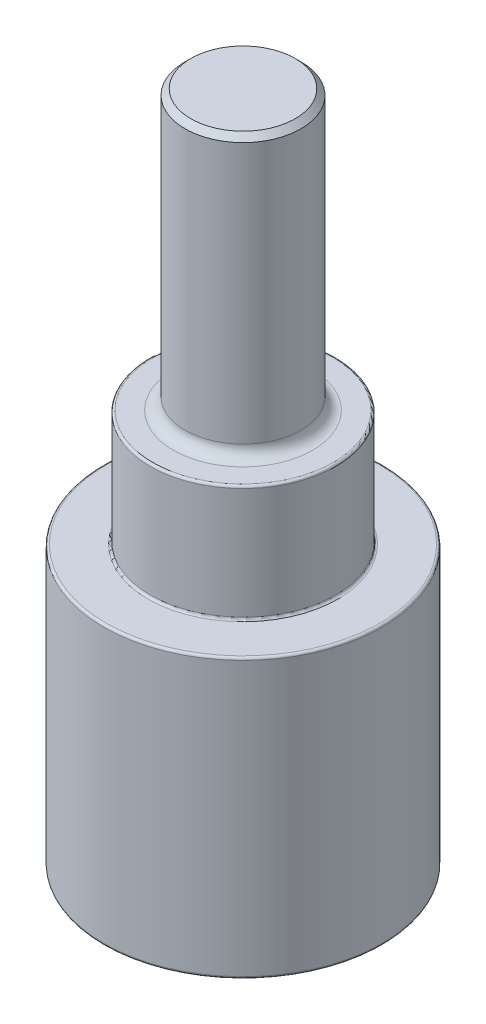
ISO-10303-21;
HEADER;
FILE_DESCRIPTION(('STEP AP214'),'2;1');
FILE_NAME('part.step','',(''),(''),'','','');
FILE_SCHEMA(('AUTOMOTIVE_DESIGN { 1 0 10303 214 1 1 1 1 }'));
ENDSEC;
DATA;
#1=APPLICATION_CONTEXT('core data for automotive mechanical design processes');
#2=APPLICATION_PROTOCOL_DEFINITION('international standard','automotive_design',2000,#1);
#3=PRODUCT_CONTEXT('',#1,'mechanical');
#4=PRODUCT('Part','Part','',(#3));
#5=PRODUCT_RELATED_PRODUCT_CATEGORY('part','',(#4));
#6=PRODUCT_DEFINITION_FORMATION('','',#4);
#7=PRODUCT_DEFINITION_CONTEXT('part definition',#1,'design');
#8=PRODUCT_DEFINITION('design','',#6,#7);
#9=PRODUCT_DEFINITION_SHAPE('','',#8);
#10=(LENGTH_UNIT() NAMED_UNIT(*) SI_UNIT(.MILLI.,.METRE.));
#11=(NAMED_UNIT(*) PLANE_ANGLE_UNIT() SI_UNIT($,.RADIAN.));
#12=(NAMED_UNIT(*) SI_UNIT($,.STERADIAN.) SOLID_ANGLE_UNIT());
#13=UNCERTAINTY_MEASURE_WITH_UNIT(LENGTH_MEASURE(1.E-05),#10,'distance_accuracy_value','');
#14=(GEOMETRIC_REPRESENTATION_CONTEXT(3) GLOBAL_UNCERTAINTY_ASSIGNED_CONTEXT((#13)) GLOBAL_UNIT_ASSIGNED_CONTEXT((#10,
#11,#12)) REPRESENTATION_CONTEXT('',''));
#15=CARTESIAN_POINT('',(0.,0.,0.));
#16=DIRECTION('',(0.,0.,1.));
#17=DIRECTION('',(1.,0.,0.));
#18=AXIS2_PLACEMENT_3D('',#15,#16,#17);
#19=CARTESIAN_POINT('',(0.,17.,0.));
#20=DIRECTION('',(0.,-1.,0.));
#21=DIRECTION('',(0.,0.,-1.));
#22=AXIS2_PLACEMENT_3D('',#19,#20,#21);
#23=PLANE('',#22);
#24=CARTESIAN_POINT('',(0.,16.9999999999959,0.));
#25=DIRECTION('',(0.,-1.,0.));
#26=DIRECTION('',(0.,0.,-1.));
#27=AXIS2_PLACEMENT_3D('',#24,#25,#26);
#28=CIRCLE('',#27,2.24999999994679);
#29=CARTESIAN_POINT('',(0.,16.9999999999959,-2.24999999994679));
#30=VERTEX_POINT('',#29);
#31=EDGE_CURVE('E20',#30,#30,#28,.T.);
#32=ORIENTED_EDGE('',*,*,#31,.F.);
#33=EDGE_LOOP('',(#32));
#34=FACE_BOUND('',#33,.T.);
#35=ADVANCED_FACE('F17',(#34),#23,.F.);
#36=CARTESIAN_POINT('',(0.,16.7500000000587,0.));
#37=DIRECTION('',(0.,-1.,0.));
#38=DIRECTION('',(0.,0.,-1.));
#39=AXIS2_PLACEMENT_3D('',#36,#37,#38);
#40=CONICAL_SURFACE('',#39,2.49999999988404,0.785398163397448);
#41=CARTESIAN_POINT('',(0.,16.75,0.));
#42=DIRECTION('',(0.,-1.,0.));
#43=DIRECTION('',(0.,0.,-1.));
#44=AXIS2_PLACEMENT_3D('',#41,#42,#43);
#45=CIRCLE('',#44,2.5);
#46=CARTESIAN_POINT('',(0.,16.75,-2.5));
#47=VERTEX_POINT('',#46);
#48=EDGE_CURVE('E168',#47,#47,#45,.T.);
#49=ORIENTED_EDGE('',*,*,#48,.F.);
#50=EDGE_LOOP('',(#49));
#51=FACE_BOUND('',#50,.T.);
#52=ORIENTED_EDGE('',*,*,#31,.T.);
#53=EDGE_LOOP('',(#52));
#54=FACE_BOUND('',#53,.T.);
#55=ADVANCED_FACE('F183',(#51,#54),#40,.T.);
#56=CARTESIAN_POINT('',(0.,17.,0.));
#57=DIRECTION('',(0.,-1.,0.));
#58=DIRECTION('',(0.,0.,-1.));
#59=AXIS2_PLACEMENT_3D('',#56,#57,#58);
#60=CYLINDRICAL_SURFACE('',#59,2.5);
#61=CARTESIAN_POINT('',(0.,5.5,0.));
#62=DIRECTION('',(0.,-1.,0.));
#63=DIRECTION('',(0.,0.,-1.));
#64=AXIS2_PLACEMENT_3D('',#61,#62,#63);
#65=CIRCLE('',#64,2.5);
#66=CARTESIAN_POINT('',(0.,5.5,-2.5));
#67=VERTEX_POINT('',#66);
#68=EDGE_CURVE('E154',#67,#67,#65,.F.);
#69=ORIENTED_EDGE('',*,*,#68,.T.);
#70=EDGE_LOOP('',(#69));
#71=FACE_BOUND('',#70,.T.);
#72=ORIENTED_EDGE('',*,*,#48,.T.);
#73=EDGE_LOOP('',(#72));
#74=FACE_BOUND('',#73,.T.);
#75=ADVANCED_FACE('F160',(#71,#74),#60,.T.);
#76=CARTESIAN_POINT('',(0.,5.5,0.));
#77=DIRECTION('',(0.,-1.,0.));
#78=DIRECTION('',(0.,0.,-1.));
#79=AXIS2_PLACEMENT_3D('',#76,#77,#78);
#80=TOROIDAL_SURFACE('',#79,3.,0.5);
#81=CARTESIAN_POINT('',(0.,5.,0.));
#82=DIRECTION('',(0.,1.,0.));
#83=DIRECTION('',(0.,0.,-1.));
#84=AXIS2_PLACEMENT_3D('',#81,#82,#83);
#85=CIRCLE('',#84,3.);
#86=CARTESIAN_POINT('',(0.,5.,-3.));
#87=VERTEX_POINT('',#86);
#88=EDGE_CURVE('E179',#87,#87,#85,.T.);
#89=ORIENTED_EDGE('',*,*,#88,.T.);
#90=EDGE_LOOP('',(#89));
#91=FACE_BOUND('',#90,.T.);
#92=ORIENTED_EDGE('',*,*,#68,.F.);
#93=EDGE_LOOP('',(#92));
#94=FACE_BOUND('',#93,.T.);
#95=ADVANCED_FACE('F156',(#91,#94),#80,.F.);
#96=CARTESIAN_POINT('',(0.,5.,0.));
#97=DIRECTION('',(0.,-1.,0.));
#98=DIRECTION('',(0.,0.,-1.));
#99=AXIS2_PLACEMENT_3D('',#96,#97,#98);
#100=PLANE('',#99);
#101=ORIENTED_EDGE('',*,*,#88,.F.);
#102=EDGE_LOOP('',(#101));
#103=FACE_BOUND('',#102,.T.);
#104=CARTESIAN_POINT('',(0.,5.,0.));
#105=DIRECTION('',(0.,-1.,0.));
#106=DIRECTION('',(0.,0.,-1.));
#107=AXIS2_PLACEMENT_3D('',#104,#105,#106);
#108=CIRCLE('',#107,3.9);
#109=CARTESIAN_POINT('',(0.,5.,-3.9));
#110=VERTEX_POINT('',#109);
#111=EDGE_CURVE('E123',#110,#110,#108,.T.);
#112=ORIENTED_EDGE('',*,*,#111,.F.);
#113=EDGE_LOOP('',(#112));
#114=FACE_BOUND('',#113,.T.);
#115=ADVANCED_FACE('F136',(#103,#114),#100,.F.);
#116=CARTESIAN_POINT('',(0.,4.9,0.));
#117=DIRECTION('',(0.,-1.,0.));
#118=DIRECTION('',(0.,0.,-1.));
#119=AXIS2_PLACEMENT_3D('',#116,#117,#118);
#120=TOROIDAL_SURFACE('',#119,3.9,0.1);
#121=CARTESIAN_POINT('',(0.,4.9,0.));
#122=DIRECTION('',(0.,-1.,0.));
#123=DIRECTION('',(0.,0.,-1.));
#124=AXIS2_PLACEMENT_3D('',#121,#122,#123);
#125=CIRCLE('',#124,4.);
#126=CARTESIAN_POINT('',(0.,4.9,-4.));
#127=VERTEX_POINT('',#126);
#128=EDGE_CURVE('E115',#127,#127,#125,.T.);
#129=ORIENTED_EDGE('',*,*,#128,.F.);
#130=EDGE_LOOP('',(#129));
#131=FACE_BOUND('',#130,.T.);
#132=ORIENTED_EDGE('',*,*,#111,.T.);
#133=EDGE_LOOP('',(#132));
#134=FACE_BOUND('',#133,.T.);
#135=ADVANCED_FACE('F131',(#131,#134),#120,.T.);
#136=CARTESIAN_POINT('',(0.,5.,0.));
#137=DIRECTION('',(0.,-1.,0.));
#138=DIRECTION('',(0.,0.,-1.));
#139=AXIS2_PLACEMENT_3D('',#136,#137,#138);
#140=CYLINDRICAL_SURFACE('',#139,4.);
#141=CARTESIAN_POINT('',(0.,0.1,0.));
#142=DIRECTION('',(0.,1.,0.));
#143=DIRECTION('',(0.,0.,1.));
#144=AXIS2_PLACEMENT_3D('',#141,#142,#143);
#145=CIRCLE('',#144,4.);
#146=CARTESIAN_POINT('',(0.,0.1,4.));
#147=VERTEX_POINT('',#146);
#148=EDGE_CURVE('E79',#147,#147,#145,.T.);
#149=ORIENTED_EDGE('',*,*,#148,.T.);
#150=EDGE_LOOP('',(#149));
#151=FACE_BOUND('',#150,.T.);
#152=ORIENTED_EDGE('',*,*,#128,.T.);
#153=EDGE_LOOP('',(#152));
#154=FACE_BOUND('',#153,.T.);
#155=ADVANCED_FACE('F135',(#151,#154),#140,.T.);
#156=CARTESIAN_POINT('',(0.,-2.,0.));
#157=DIRECTION('',(0.,-1.,0.));
#158=DIRECTION('',(0.,0.,-1.));
#159=AXIS2_PLACEMENT_3D('',#156,#157,#158);
#160=PLANE('',#159);
#161=DIRECTION('',(-0.86602540378444,0.,0.499999999999998));
#162=VECTOR('',#161,1.);
#163=CARTESIAN_POINT('',(-3.04999999999999,-2.,-1.76091832102837));
#164=LINE('',#163,#162);
#165=CARTESIAN_POINT('',(-3.04999999999999,-2.,-1.76091832102837));
#166=VERTEX_POINT('',#165);
#167=CARTESIAN_POINT('',(0.,-2.,-3.52183664205672));
#168=VERTEX_POINT('',#167);
#169=EDGE_CURVE('E93',#166,#168,#164,.F.);
#170=ORIENTED_EDGE('',*,*,#169,.T.);
#171=DIRECTION('',(-0.866025403784437,0.,-0.500000000000003));
#172=VECTOR('',#171,1.);
#173=CARTESIAN_POINT('',(0.,-2.,-3.52183664205672));
#174=LINE('',#173,#172);
#175=CARTESIAN_POINT('',(3.05,-2.,-1.76091832102835));
#176=VERTEX_POINT('',#175);
#177=EDGE_CURVE('E282',#168,#176,#174,.F.);
#178=ORIENTED_EDGE('',*,*,#177,.T.);
#179=DIRECTION('',(0.,0.,-1.));
#180=VECTOR('',#179,1.);
#181=CARTESIAN_POINT('',(3.05,-2.,-1.76091832102835));
#182=LINE('',#181,#180);
#183=CARTESIAN_POINT('',(3.04999999999999,-2.,1.76091832102836));
#184=VERTEX_POINT('',#183);
#185=EDGE_CURVE('E277',#176,#184,#182,.F.);
#186=ORIENTED_EDGE('',*,*,#185,.T.);
#187=DIRECTION('',(0.86602540378444,0.,-0.499999999999998));
#188=VECTOR('',#187,1.);
#189=CARTESIAN_POINT('',(3.04999999999999,-2.,1.76091832102836));
#190=LINE('',#189,#188);
#191=CARTESIAN_POINT('',(0.,-2.,3.5218366420567));
#192=VERTEX_POINT('',#191);
#193=EDGE_CURVE('E75',#184,#192,#190,.F.);
#194=ORIENTED_EDGE('',*,*,#193,.T.);
#195=DIRECTION('',(0.866025403784438,0.,0.5));
#196=VECTOR('',#195,1.);
#197=CARTESIAN_POINT('',(0.,-2.,3.5218366420567));
#198=LINE('',#197,#196);
#199=CARTESIAN_POINT('',(-3.04999999999999,-2.,1.76091832102834));
#200=VERTEX_POINT('',#199);
#201=EDGE_CURVE('E71',#192,#200,#198,.F.);
#202=ORIENTED_EDGE('',*,*,#201,.T.);
#203=DIRECTION('',(0.,0.,1.));
#204=VECTOR('',#203,1.);
#205=CARTESIAN_POINT('',(-3.04999999999999,-2.,1.76091832102834));
#206=LINE('',#205,#204);
#207=EDGE_CURVE('E68',#200,#166,#206,.F.);
#208=ORIENTED_EDGE('',*,*,#207,.T.);
#209=EDGE_LOOP('',(#170,#178,#186,#194,#202,#208));
#210=FACE_BOUND('',#209,.T.);
#211=ADVANCED_FACE('F73',(#210),#160,.T.);
#212=CARTESIAN_POINT('',(0.,0.1,0.));
#213=DIRECTION('',(0.,1.,0.));
#214=DIRECTION('',(0.,0.,1.));
#215=AXIS2_PLACEMENT_3D('',#212,#213,#214);
#216=TOROIDAL_SURFACE('',#215,4.1,0.1);
#217=CARTESIAN_POINT('',(0.,0.,0.));
#218=DIRECTION('',(0.,1.,0.));
#219=DIRECTION('',(0.,0.,1.));
#220=AXIS2_PLACEMENT_3D('',#217,#218,#219);
#221=CIRCLE('',#220,4.1);
#222=CARTESIAN_POINT('',(0.,0.,4.1));
#223=VERTEX_POINT('',#222);
#224=EDGE_CURVE('E273',#223,#223,#221,.F.);
#225=ORIENTED_EDGE('',*,*,#224,.F.);
#226=EDGE_LOOP('',(#225));
#227=FACE_BOUND('',#226,.T.);
#228=ORIENTED_EDGE('',*,*,#148,.F.);
#229=EDGE_LOOP('',(#228));
#230=FACE_BOUND('',#229,.T.);
#231=ADVANCED_FACE('F101',(#227,#230),#216,.F.);
#232=CARTESIAN_POINT('',(0.,-2.,3.5218366420567));
#233=DIRECTION('',(-0.5,0.,0.866025403784438));
#234=DIRECTION('',(0.866025403784438,0.,0.5));
#235=AXIS2_PLACEMENT_3D('',#232,#233,#234);
#236=PLANE('',#235);
#237=DIRECTION('',(0.,1.,0.));
#238=VECTOR('',#237,1.);
#239=CARTESIAN_POINT('',(-3.04999999999999,-2.,1.76091832102834));
#240=LINE('',#239,#238);
#241=CARTESIAN_POINT('',(-3.04999999999999,-12.,1.76091832102834));
#242=VERTEX_POINT('',#241);
#243=EDGE_CURVE('E78',#242,#200,#240,.T.);
#244=ORIENTED_EDGE('',*,*,#243,.T.);
#245=ORIENTED_EDGE('',*,*,#201,.F.);
#246=DIRECTION('',(0.,1.,0.));
#247=VECTOR('',#246,1.);
#248=CARTESIAN_POINT('',(0.,-2.,3.5218366420567));
#249=LINE('',#248,#247);
#250=CARTESIAN_POINT('',(0.,-12.,3.5218366420567));
#251=VERTEX_POINT('',#250);
#252=EDGE_CURVE('E266',#192,#251,#249,.F.);
#253=ORIENTED_EDGE('',*,*,#252,.T.);
#254=DIRECTION('',(-0.866025403784438,0.,-0.500000000000002));
#255=VECTOR('',#254,1.);
#256=CARTESIAN_POINT('',(0.,-12.,3.5218366420567));
#257=LINE('',#256,#255);
#258=EDGE_CURVE('E84',#251,#242,#257,.T.);
#259=ORIENTED_EDGE('',*,*,#258,.T.);
#260=EDGE_LOOP('',(#244,#245,#253,#259));
#261=FACE_BOUND('',#260,.T.);
#262=ADVANCED_FACE('F82',(#261),#236,.F.);
#263=CARTESIAN_POINT('',(-3.04999999999999,-2.,1.76091832102834));
#264=DIRECTION('',(-1.,0.,0.));
#265=DIRECTION('',(0.,0.,1.));
#266=AXIS2_PLACEMENT_3D('',#263,#264,#265);
#267=PLANE('',#266);
#268=DIRECTION('',(0.,1.,0.));
#269=VECTOR('',#268,1.);
#270=CARTESIAN_POINT('',(-3.04999999999999,-2.,-1.76091832102837));
#271=LINE('',#270,#269);
#272=CARTESIAN_POINT('',(-3.04999999999999,-12.,-1.76091832102837));
#273=VERTEX_POINT('',#272);
#274=EDGE_CURVE('E90',#273,#166,#271,.T.);
#275=ORIENTED_EDGE('',*,*,#274,.T.);
#276=ORIENTED_EDGE('',*,*,#207,.F.);
#277=ORIENTED_EDGE('',*,*,#243,.F.);
#278=DIRECTION('',(0.,0.,1.));
#279=VECTOR('',#278,1.);
#280=CARTESIAN_POINT('',(-3.04999999999999,-12.,0.));
#281=LINE('',#280,#279);
#282=EDGE_CURVE('E302',#242,#273,#281,.F.);
#283=ORIENTED_EDGE('',*,*,#282,.T.);
#284=EDGE_LOOP('',(#275,#276,#277,#283));
#285=FACE_BOUND('',#284,.T.);
#286=ADVANCED_FACE('F88',(#285),#267,.F.);
#287=CARTESIAN_POINT('',(-3.04999999999999,-2.,-1.76091832102837));
#288=DIRECTION('',(-0.499999999999998,0.,-0.86602540378444));
#289=DIRECTION('',(-0.86602540378444,0.,0.499999999999998));
#290=AXIS2_PLACEMENT_3D('',#287,#288,#289);
#291=PLANE('',#290);
#292=DIRECTION('',(0.,1.,0.));
#293=VECTOR('',#292,1.);
#294=CARTESIAN_POINT('',(0.,-2.,-3.52183664205672));
#295=LINE('',#294,#293);
#296=CARTESIAN_POINT('',(0.,-12.,-3.52183664205672));
#297=VERTEX_POINT('',#296);
#298=EDGE_CURVE('E284',#297,#168,#295,.T.);
#299=ORIENTED_EDGE('',*,*,#298,.T.);
#300=ORIENTED_EDGE('',*,*,#169,.F.);
#301=ORIENTED_EDGE('',*,*,#274,.F.);
#302=DIRECTION('',(0.866025403784441,0.,-0.499999999999996));
#303=VECTOR('',#302,1.);
#304=CARTESIAN_POINT('',(-3.04999999999999,-12.,-1.76091832102837));
#305=LINE('',#304,#303);
#306=EDGE_CURVE('E291',#273,#297,#305,.T.);
#307=ORIENTED_EDGE('',*,*,#306,.T.);
#308=EDGE_LOOP('',(#299,#300,#301,#307));
#309=FACE_BOUND('',#308,.T.);
#310=ADVANCED_FACE('F289',(#309),#291,.F.);
#311=CARTESIAN_POINT('',(0.,-2.,-3.52183664205672));
#312=DIRECTION('',(0.500000000000003,0.,-0.866025403784437));
#313=DIRECTION('',(-0.866025403784437,0.,-0.500000000000003));
#314=AXIS2_PLACEMENT_3D('',#311,#312,#313);
#315=PLANE('',#314);
#316=DIRECTION('',(0.,1.,0.));
#317=VECTOR('',#316,1.);
#318=CARTESIAN_POINT('',(3.05,-2.,-1.76091832102835));
#319=LINE('',#318,#317);
#320=CARTESIAN_POINT('',(3.05,-12.,-1.76091832102835));
#321=VERTEX_POINT('',#320);
#322=EDGE_CURVE('E279',#321,#176,#319,.T.);
#323=ORIENTED_EDGE('',*,*,#322,.T.);
#324=ORIENTED_EDGE('',*,*,#177,.F.);
#325=ORIENTED_EDGE('',*,*,#298,.F.);
#326=DIRECTION('',(0.866025403784438,0.,0.500000000000002));
#327=VECTOR('',#326,1.);
#328=CARTESIAN_POINT('',(0.,-12.,-3.52183664205671));
#329=LINE('',#328,#327);
#330=EDGE_CURVE('E296',#297,#321,#329,.T.);
#331=ORIENTED_EDGE('',*,*,#330,.T.);
#332=EDGE_LOOP('',(#323,#324,#325,#331));
#333=FACE_BOUND('',#332,.T.);
#334=ADVANCED_FACE('F294',(#333),#315,.F.);
#335=CARTESIAN_POINT('',(3.05,-2.,-1.76091832102835));
#336=DIRECTION('',(1.,0.,0.));
#337=DIRECTION('',(0.,0.,-1.));
#338=AXIS2_PLACEMENT_3D('',#335,#336,#337);
#339=PLANE('',#338);
#340=DIRECTION('',(0.,1.,0.));
#341=VECTOR('',#340,1.);
#342=CARTESIAN_POINT('',(3.04999999999999,-2.,1.76091832102836));
#343=LINE('',#342,#341);
#344=CARTESIAN_POINT('',(3.04999999999999,-12.,1.76091832102836));
#345=VERTEX_POINT('',#344);
#346=EDGE_CURVE('E275',#345,#184,#343,.T.);
#347=ORIENTED_EDGE('',*,*,#346,.T.);
#348=ORIENTED_EDGE('',*,*,#185,.F.);
#349=ORIENTED_EDGE('',*,*,#322,.F.);
#350=DIRECTION('',(0.,0.,1.));
#351=VECTOR('',#350,1.);
#352=CARTESIAN_POINT('',(3.05,-12.,0.));
#353=LINE('',#352,#351);
#354=EDGE_CURVE('E35',#321,#345,#353,.T.);
#355=ORIENTED_EDGE('',*,*,#354,.T.);
#356=EDGE_LOOP('',(#347,#348,#349,#355));
#357=FACE_BOUND('',#356,.T.);
#358=ADVANCED_FACE('F297',(#357),#339,.F.);
#359=CARTESIAN_POINT('',(3.04999999999999,-2.,1.76091832102836));
#360=DIRECTION('',(0.499999999999998,0.,0.86602540378444));
#361=DIRECTION('',(0.86602540378444,0.,-0.499999999999998));
#362=AXIS2_PLACEMENT_3D('',#359,#360,#361);
#363=PLANE('',#362);
#364=ORIENTED_EDGE('',*,*,#252,.F.);
#365=ORIENTED_EDGE('',*,*,#193,.F.);
#366=ORIENTED_EDGE('',*,*,#346,.F.);
#367=DIRECTION('',(-0.86602540378444,0.,0.499999999999997));
#368=VECTOR('',#367,1.);
#369=CARTESIAN_POINT('',(3.04999999999999,-12.,1.76091832102836));
#370=LINE('',#369,#368);
#371=EDGE_CURVE('E224',#345,#251,#370,.T.);
#372=ORIENTED_EDGE('',*,*,#371,.T.);
#373=EDGE_LOOP('',(#364,#365,#366,#372));
#374=FACE_BOUND('',#373,.T.);
#375=ADVANCED_FACE('F239',(#374),#363,.F.);
#376=CARTESIAN_POINT('',(0.,0.,0.));
#377=DIRECTION('',(0.,1.,0.));
#378=DIRECTION('',(0.,0.,1.));
#379=AXIS2_PLACEMENT_3D('',#376,#377,#378);
#380=PLANE('',#379);
#381=ORIENTED_EDGE('',*,*,#224,.T.);
#382=EDGE_LOOP('',(#381));
#383=FACE_BOUND('',#382,.T.);
#384=CARTESIAN_POINT('',(0.,0.,0.));
#385=DIRECTION('',(0.,-1.,0.));
#386=DIRECTION('',(0.,0.,1.));
#387=AXIS2_PLACEMENT_3D('',#384,#385,#386);
#388=CIRCLE('',#387,5.9);
#389=CARTESIAN_POINT('',(0.,0.,5.9));
#390=VERTEX_POINT('',#389);
#391=EDGE_CURVE('E262',#390,#390,#388,.T.);
#392=ORIENTED_EDGE('',*,*,#391,.F.);
#393=EDGE_LOOP('',(#392));
#394=FACE_BOUND('',#393,.T.);
#395=ADVANCED_FACE('F235',(#383,#394),#380,.T.);
#396=CARTESIAN_POINT('',(0.,-12.,0.));
#397=DIRECTION('',(0.,1.,0.));
#398=DIRECTION('',(0.,0.,1.));
#399=AXIS2_PLACEMENT_3D('',#396,#397,#398);
#400=PLANE('',#399);
#401=CARTESIAN_POINT('',(0.,-12.,0.));
#402=DIRECTION('',(0.,1.,0.));
#403=DIRECTION('',(0.,0.,1.));
#404=AXIS2_PLACEMENT_3D('',#401,#402,#403);
#405=CIRCLE('',#404,5.9);
#406=CARTESIAN_POINT('',(0.,-12.,5.9));
#407=VERTEX_POINT('',#406);
#408=EDGE_CURVE('E220',#407,#407,#405,.T.);
#409=ORIENTED_EDGE('',*,*,#408,.F.);
#410=EDGE_LOOP('',(#409));
#411=FACE_BOUND('',#410,.T.);
#412=ORIENTED_EDGE('',*,*,#354,.F.);
#413=ORIENTED_EDGE('',*,*,#330,.F.);
#414=ORIENTED_EDGE('',*,*,#306,.F.);
#415=ORIENTED_EDGE('',*,*,#282,.F.);
#416=ORIENTED_EDGE('',*,*,#258,.F.);
#417=ORIENTED_EDGE('',*,*,#371,.F.);
#418=EDGE_LOOP('',(#412,#413,#414,#415,#416,#417));
#419=FACE_BOUND('',#418,.T.);
#420=ADVANCED_FACE('F226',(#411,#419),#400,.F.);
#421=CARTESIAN_POINT('',(0.,-0.0999999999999994,0.));
#422=DIRECTION('',(0.,1.,0.));
#423=DIRECTION('',(0.,0.,1.));
#424=AXIS2_PLACEMENT_3D('',#421,#422,#423);
#425=TOROIDAL_SURFACE('',#424,5.9,0.1);
#426=ORIENTED_EDGE('',*,*,#391,.T.);
#427=EDGE_LOOP('',(#426));
#428=FACE_BOUND('',#427,.T.);
#429=CARTESIAN_POINT('',(0.,-0.0999999999999994,0.));
#430=DIRECTION('',(0.,1.,0.));
#431=DIRECTION('',(0.,0.,1.));
#432=AXIS2_PLACEMENT_3D('',#429,#430,#431);
#433=CIRCLE('',#432,6.);
#434=CARTESIAN_POINT('',(0.,-0.0999999999999994,6.));
#435=VERTEX_POINT('',#434);
#436=EDGE_CURVE('E26',#435,#435,#433,.F.);
#437=ORIENTED_EDGE('',*,*,#436,.F.);
#438=EDGE_LOOP('',(#437));
#439=FACE_BOUND('',#438,.T.);
#440=ADVANCED_FACE('F199',(#428,#439),#425,.T.);
#441=CARTESIAN_POINT('',(0.,-11.9,0.));
#442=DIRECTION('',(0.,1.,0.));
#443=DIRECTION('',(0.,0.,1.));
#444=AXIS2_PLACEMENT_3D('',#441,#442,#443);
#445=TOROIDAL_SURFACE('',#444,5.9,0.1);
#446=CARTESIAN_POINT('',(0.,-11.9,0.));
#447=DIRECTION('',(0.,1.,0.));
#448=DIRECTION('',(0.,0.,1.));
#449=AXIS2_PLACEMENT_3D('',#446,#447,#448);
#450=CIRCLE('',#449,6.);
#451=CARTESIAN_POINT('',(0.,-11.9,6.));
#452=VERTEX_POINT('',#451);
#453=EDGE_CURVE('E11',#452,#452,#450,.T.);
#454=ORIENTED_EDGE('',*,*,#453,.F.);
#455=EDGE_LOOP('',(#454));
#456=FACE_BOUND('',#455,.T.);
#457=ORIENTED_EDGE('',*,*,#408,.T.);
#458=EDGE_LOOP('',(#457));
#459=FACE_BOUND('',#458,.T.);
#460=ADVANCED_FACE('F193',(#456,#459),#445,.T.);
#461=CARTESIAN_POINT('',(0.,-12.,0.));
#462=DIRECTION('',(0.,1.,0.));
#463=DIRECTION('',(0.,0.,1.));
#464=AXIS2_PLACEMENT_3D('',#461,#462,#463);
#465=CYLINDRICAL_SURFACE('',#464,6.);
#466=ORIENTED_EDGE('',*,*,#453,.T.);
#467=EDGE_LOOP('',(#466));
#468=FACE_BOUND('',#467,.T.);
#469=ORIENTED_EDGE('',*,*,#436,.T.);
#470=EDGE_LOOP('',(#469));
#471=FACE_BOUND('',#470,.T.);
#472=ADVANCED_FACE('F191',(#468,#471),#465,.T.);
#473=CLOSED_SHELL('',(#35,#55,#75,#95,#115,#135,#155,#211,#231,#262,#286,#310,#334,#358,#375,
#395,#420,#440,#460,#472));
#474=MANIFOLD_SOLID_BREP('B1',#473);
#475=ADVANCED_BREP_SHAPE_REPRESENTATION('',(#18,#474),#14);
#476=SHAPE_DEFINITION_REPRESENTATION(#9,#475);
ENDSEC;
END-ISO-10303-21;
